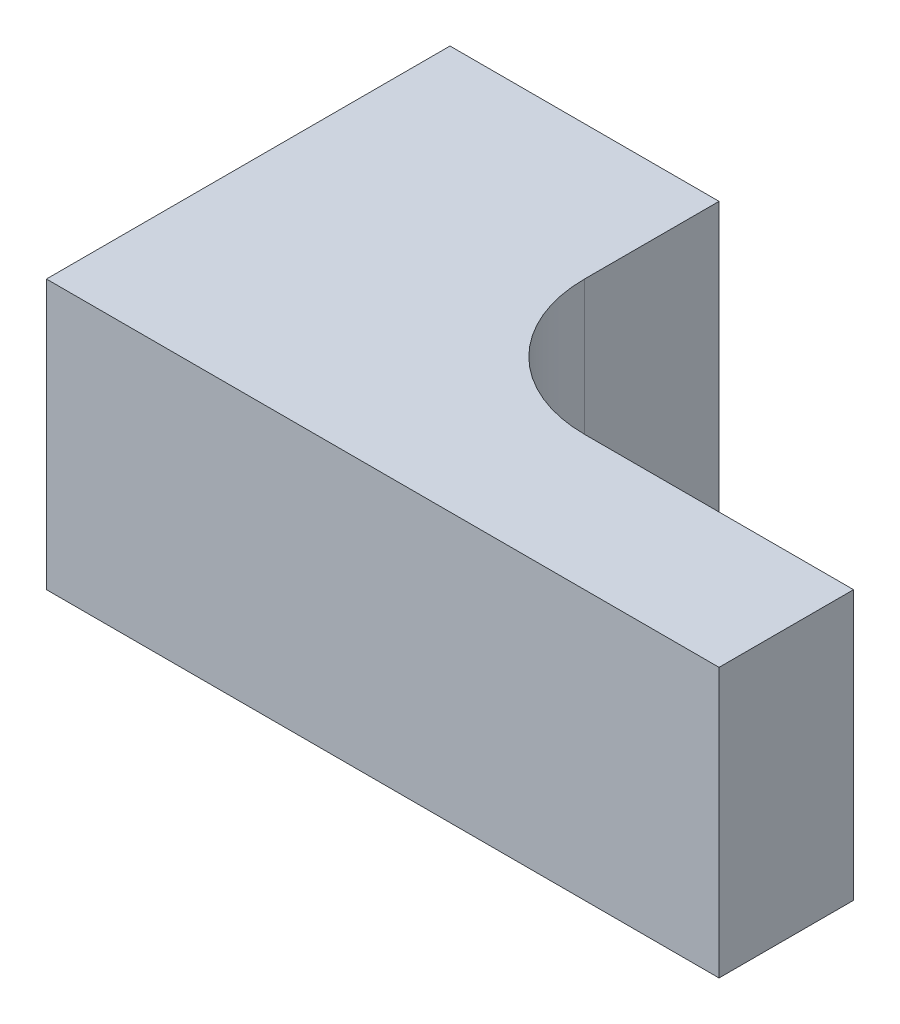
ISO-10303-21;
HEADER;
FILE_DESCRIPTION(('STEP AP214'),'2;1');
FILE_NAME('part.step','',(''),(''),'','','');
FILE_SCHEMA(('AUTOMOTIVE_DESIGN { 1 0 10303 214 1 1 1 1 }'));
ENDSEC;
DATA;
#1=APPLICATION_CONTEXT('core data for automotive mechanical design processes');
#2=APPLICATION_PROTOCOL_DEFINITION('international standard','automotive_design',2000,#1);
#3=PRODUCT_CONTEXT('',#1,'mechanical');
#4=PRODUCT('Part','Part','',(#3));
#5=PRODUCT_RELATED_PRODUCT_CATEGORY('part','',(#4));
#6=PRODUCT_DEFINITION_FORMATION('','',#4);
#7=PRODUCT_DEFINITION_CONTEXT('part definition',#1,'design');
#8=PRODUCT_DEFINITION('design','',#6,#7);
#9=PRODUCT_DEFINITION_SHAPE('','',#8);
#10=(LENGTH_UNIT() NAMED_UNIT(*) SI_UNIT(.MILLI.,.METRE.));
#11=(NAMED_UNIT(*) PLANE_ANGLE_UNIT() SI_UNIT($,.RADIAN.));
#12=(NAMED_UNIT(*) SI_UNIT($,.STERADIAN.) SOLID_ANGLE_UNIT());
#13=UNCERTAINTY_MEASURE_WITH_UNIT(LENGTH_MEASURE(1.E-05),#10,'distance_accuracy_value','');
#14=(GEOMETRIC_REPRESENTATION_CONTEXT(3) GLOBAL_UNCERTAINTY_ASSIGNED_CONTEXT((#13)) GLOBAL_UNIT_ASSIGNED_CONTEXT((#10,
#11,#12)) REPRESENTATION_CONTEXT('',''));
#15=CARTESIAN_POINT('',(0.,0.,0.));
#16=DIRECTION('',(0.,0.,1.));
#17=DIRECTION('',(1.,0.,0.));
#18=AXIS2_PLACEMENT_3D('',#15,#16,#17);
#19=CARTESIAN_POINT('',(-20.,20.,0.));
#20=DIRECTION('',(0.,0.,1.));
#21=DIRECTION('',(1.,0.,0.));
#22=AXIS2_PLACEMENT_3D('',#19,#20,#21);
#23=PLANE('',#22);
#24=DIRECTION('',(-1.,0.,0.));
#25=VECTOR('',#24,1.);
#26=CARTESIAN_POINT('',(-20.,0.,0.));
#27=LINE('',#26,#25);
#28=CARTESIAN_POINT('',(0.,0.,0.));
#29=VERTEX_POINT('',#28);
#30=CARTESIAN_POINT('',(-20.,0.,0.));
#31=VERTEX_POINT('',#30);
#32=EDGE_CURVE('E134',#29,#31,#27,.T.);
#33=ORIENTED_EDGE('',*,*,#32,.T.);
#34=DIRECTION('',(0.,-1.,0.));
#35=VECTOR('',#34,1.);
#36=CARTESIAN_POINT('',(-20.,20.,0.));
#37=LINE('',#36,#35);
#38=CARTESIAN_POINT('',(-20.,20.,0.));
#39=VERTEX_POINT('',#38);
#40=EDGE_CURVE('E11',#39,#31,#37,.T.);
#41=ORIENTED_EDGE('',*,*,#40,.F.);
#42=DIRECTION('',(-1.,0.,0.));
#43=VECTOR('',#42,1.);
#44=CARTESIAN_POINT('',(-20.,20.,0.));
#45=LINE('',#44,#43);
#46=CARTESIAN_POINT('',(0.,20.,0.));
#47=VERTEX_POINT('',#46);
#48=EDGE_CURVE('E153',#47,#39,#45,.T.);
#49=ORIENTED_EDGE('',*,*,#48,.F.);
#50=DIRECTION('',(0.,-1.,0.));
#51=VECTOR('',#50,1.);
#52=CARTESIAN_POINT('',(0.,20.,0.));
#53=LINE('',#52,#51);
#54=EDGE_CURVE('E130',#47,#29,#53,.T.);
#55=ORIENTED_EDGE('',*,*,#54,.T.);
#56=EDGE_LOOP('',(#33,#41,#49,#55));
#57=FACE_BOUND('',#56,.T.);
#58=ADVANCED_FACE('F39',(#57),#23,.F.);
#59=CARTESIAN_POINT('',(-20.,20.,30.));
#60=DIRECTION('',(1.,0.,0.));
#61=DIRECTION('',(0.,0.,-1.));
#62=AXIS2_PLACEMENT_3D('',#59,#60,#61);
#63=PLANE('',#62);
#64=DIRECTION('',(0.,0.,1.));
#65=VECTOR('',#64,1.);
#66=CARTESIAN_POINT('',(-20.,0.,30.));
#67=LINE('',#66,#65);
#68=CARTESIAN_POINT('',(-20.,0.,30.));
#69=VERTEX_POINT('',#68);
#70=EDGE_CURVE('E138',#31,#69,#67,.T.);
#71=ORIENTED_EDGE('',*,*,#70,.T.);
#72=DIRECTION('',(0.,-1.,0.));
#73=VECTOR('',#72,1.);
#74=CARTESIAN_POINT('',(-20.,20.,30.));
#75=LINE('',#74,#73);
#76=CARTESIAN_POINT('',(-20.,20.,30.));
#77=VERTEX_POINT('',#76);
#78=EDGE_CURVE('E48',#77,#69,#75,.T.);
#79=ORIENTED_EDGE('',*,*,#78,.F.);
#80=DIRECTION('',(0.,0.,1.));
#81=VECTOR('',#80,1.);
#82=CARTESIAN_POINT('',(-20.,20.,30.));
#83=LINE('',#82,#81);
#84=EDGE_CURVE('E96',#39,#77,#83,.T.);
#85=ORIENTED_EDGE('',*,*,#84,.F.);
#86=ORIENTED_EDGE('',*,*,#40,.T.);
#87=EDGE_LOOP('',(#71,#79,#85,#86));
#88=FACE_BOUND('',#87,.T.);
#89=ADVANCED_FACE('F187',(#88),#63,.F.);
#90=CARTESIAN_POINT('',(30.,20.,30.));
#91=DIRECTION('',(0.,0.,-1.));
#92=DIRECTION('',(-1.,0.,0.));
#93=AXIS2_PLACEMENT_3D('',#90,#91,#92);
#94=PLANE('',#93);
#95=DIRECTION('',(1.,0.,0.));
#96=VECTOR('',#95,1.);
#97=CARTESIAN_POINT('',(30.,0.,30.));
#98=LINE('',#97,#96);
#99=CARTESIAN_POINT('',(30.,0.,30.));
#100=VERTEX_POINT('',#99);
#101=EDGE_CURVE('E141',#69,#100,#98,.T.);
#102=ORIENTED_EDGE('',*,*,#101,.T.);
#103=DIRECTION('',(0.,-1.,0.));
#104=VECTOR('',#103,1.);
#105=CARTESIAN_POINT('',(30.,20.,30.));
#106=LINE('',#105,#104);
#107=CARTESIAN_POINT('',(30.,20.,30.));
#108=VERTEX_POINT('',#107);
#109=EDGE_CURVE('E160',#108,#100,#106,.T.);
#110=ORIENTED_EDGE('',*,*,#109,.F.);
#111=DIRECTION('',(1.,0.,0.));
#112=VECTOR('',#111,1.);
#113=CARTESIAN_POINT('',(30.,20.,30.));
#114=LINE('',#113,#112);
#115=EDGE_CURVE('E170',#77,#108,#114,.T.);
#116=ORIENTED_EDGE('',*,*,#115,.F.);
#117=ORIENTED_EDGE('',*,*,#78,.T.);
#118=EDGE_LOOP('',(#102,#110,#116,#117));
#119=FACE_BOUND('',#118,.T.);
#120=ADVANCED_FACE('F168',(#119),#94,.F.);
#121=CARTESIAN_POINT('',(30.,20.,20.));
#122=DIRECTION('',(-1.,0.,0.));
#123=DIRECTION('',(0.,0.,1.));
#124=AXIS2_PLACEMENT_3D('',#121,#122,#123);
#125=PLANE('',#124);
#126=DIRECTION('',(0.,0.,-1.));
#127=VECTOR('',#126,1.);
#128=CARTESIAN_POINT('',(30.,0.,20.));
#129=LINE('',#128,#127);
#130=CARTESIAN_POINT('',(30.,0.,20.));
#131=VERTEX_POINT('',#130);
#132=EDGE_CURVE('E144',#100,#131,#129,.T.);
#133=ORIENTED_EDGE('',*,*,#132,.T.);
#134=DIRECTION('',(0.,-1.,0.));
#135=VECTOR('',#134,1.);
#136=CARTESIAN_POINT('',(30.,20.,20.));
#137=LINE('',#136,#135);
#138=CARTESIAN_POINT('',(30.,20.,20.));
#139=VERTEX_POINT('',#138);
#140=EDGE_CURVE('E123',#139,#131,#137,.T.);
#141=ORIENTED_EDGE('',*,*,#140,.F.);
#142=DIRECTION('',(0.,0.,-1.));
#143=VECTOR('',#142,1.);
#144=CARTESIAN_POINT('',(30.,20.,20.));
#145=LINE('',#144,#143);
#146=EDGE_CURVE('E112',#108,#139,#145,.T.);
#147=ORIENTED_EDGE('',*,*,#146,.F.);
#148=ORIENTED_EDGE('',*,*,#109,.T.);
#149=EDGE_LOOP('',(#133,#141,#147,#148));
#150=FACE_BOUND('',#149,.T.);
#151=ADVANCED_FACE('F176',(#150),#125,.F.);
#152=CARTESIAN_POINT('',(10.,20.,20.));
#153=DIRECTION('',(0.,0.,1.));
#154=DIRECTION('',(1.,0.,0.));
#155=AXIS2_PLACEMENT_3D('',#152,#153,#154);
#156=PLANE('',#155);
#157=DIRECTION('',(-1.,0.,0.));
#158=VECTOR('',#157,1.);
#159=CARTESIAN_POINT('',(10.,0.,20.));
#160=LINE('',#159,#158);
#161=CARTESIAN_POINT('',(10.,0.,20.));
#162=VERTEX_POINT('',#161);
#163=EDGE_CURVE('E121',#131,#162,#160,.T.);
#164=ORIENTED_EDGE('',*,*,#163,.T.);
#165=DIRECTION('',(0.,-1.,0.));
#166=VECTOR('',#165,1.);
#167=CARTESIAN_POINT('',(10.,20.,20.));
#168=LINE('',#167,#166);
#169=CARTESIAN_POINT('',(10.,20.,20.));
#170=VERTEX_POINT('',#169);
#171=EDGE_CURVE('E118',#170,#162,#168,.T.);
#172=ORIENTED_EDGE('',*,*,#171,.F.);
#173=DIRECTION('',(-1.,0.,0.));
#174=VECTOR('',#173,1.);
#175=CARTESIAN_POINT('',(10.,20.,20.));
#176=LINE('',#175,#174);
#177=EDGE_CURVE('E106',#139,#170,#176,.T.);
#178=ORIENTED_EDGE('',*,*,#177,.F.);
#179=ORIENTED_EDGE('',*,*,#140,.T.);
#180=EDGE_LOOP('',(#164,#172,#178,#179));
#181=FACE_BOUND('',#180,.T.);
#182=ADVANCED_FACE('F119',(#181),#156,.F.);
#183=CARTESIAN_POINT('',(10.,20.,10.));
#184=DIRECTION('',(0.,-1.,0.));
#185=DIRECTION('',(0.,0.,-1.));
#186=AXIS2_PLACEMENT_3D('',#183,#184,#185);
#187=CYLINDRICAL_SURFACE('',#186,10.);
#188=CARTESIAN_POINT('',(10.,0.,10.));
#189=DIRECTION('',(0.,-1.,0.));
#190=DIRECTION('',(0.,0.,1.));
#191=AXIS2_PLACEMENT_3D('',#188,#189,#190);
#192=CIRCLE('',#191,10.);
#193=CARTESIAN_POINT('',(0.,0.,10.));
#194=VERTEX_POINT('',#193);
#195=EDGE_CURVE('E82',#162,#194,#192,.T.);
#196=ORIENTED_EDGE('',*,*,#195,.T.);
#197=DIRECTION('',(0.,-1.,0.));
#198=VECTOR('',#197,1.);
#199=CARTESIAN_POINT('',(0.,20.,10.));
#200=LINE('',#199,#198);
#201=CARTESIAN_POINT('',(0.,20.,10.));
#202=VERTEX_POINT('',#201);
#203=EDGE_CURVE('E124',#202,#194,#200,.T.);
#204=ORIENTED_EDGE('',*,*,#203,.F.);
#205=CARTESIAN_POINT('',(10.,20.,10.));
#206=DIRECTION('',(0.,-1.,0.));
#207=DIRECTION('',(0.,0.,1.));
#208=AXIS2_PLACEMENT_3D('',#205,#206,#207);
#209=CIRCLE('',#208,10.);
#210=EDGE_CURVE('E110',#170,#202,#209,.T.);
#211=ORIENTED_EDGE('',*,*,#210,.F.);
#212=ORIENTED_EDGE('',*,*,#171,.T.);
#213=EDGE_LOOP('',(#196,#204,#211,#212));
#214=FACE_BOUND('',#213,.T.);
#215=ADVANCED_FACE('F126',(#214),#187,.F.);
#216=CARTESIAN_POINT('',(0.,20.,0.));
#217=DIRECTION('',(-1.,0.,0.));
#218=DIRECTION('',(0.,0.,1.));
#219=AXIS2_PLACEMENT_3D('',#216,#217,#218);
#220=PLANE('',#219);
#221=DIRECTION('',(0.,0.,-1.));
#222=VECTOR('',#221,1.);
#223=CARTESIAN_POINT('',(0.,0.,0.));
#224=LINE('',#223,#222);
#225=EDGE_CURVE('E88',#194,#29,#224,.T.);
#226=ORIENTED_EDGE('',*,*,#225,.T.);
#227=ORIENTED_EDGE('',*,*,#54,.F.);
#228=DIRECTION('',(0.,0.,-1.));
#229=VECTOR('',#228,1.);
#230=CARTESIAN_POINT('',(0.,20.,0.));
#231=LINE('',#230,#229);
#232=EDGE_CURVE('E56',#202,#47,#231,.T.);
#233=ORIENTED_EDGE('',*,*,#232,.F.);
#234=ORIENTED_EDGE('',*,*,#203,.T.);
#235=EDGE_LOOP('',(#226,#227,#233,#234));
#236=FACE_BOUND('',#235,.T.);
#237=ADVANCED_FACE('F201',(#236),#220,.F.);
#238=CARTESIAN_POINT('',(10.,20.,10.));
#239=DIRECTION('',(0.,1.,0.));
#240=DIRECTION('',(0.,0.,1.));
#241=AXIS2_PLACEMENT_3D('',#238,#239,#240);
#242=PLANE('',#241);
#243=ORIENTED_EDGE('',*,*,#48,.T.);
#244=ORIENTED_EDGE('',*,*,#84,.T.);
#245=ORIENTED_EDGE('',*,*,#115,.T.);
#246=ORIENTED_EDGE('',*,*,#146,.T.);
#247=ORIENTED_EDGE('',*,*,#177,.T.);
#248=ORIENTED_EDGE('',*,*,#210,.T.);
#249=ORIENTED_EDGE('',*,*,#232,.T.);
#250=EDGE_LOOP('',(#243,#244,#245,#246,#247,#248,#249));
#251=FACE_BOUND('',#250,.T.);
#252=ADVANCED_FACE('F108',(#251),#242,.T.);
#253=CARTESIAN_POINT('',(10.,0.,10.));
#254=DIRECTION('',(0.,1.,0.));
#255=DIRECTION('',(0.,0.,1.));
#256=AXIS2_PLACEMENT_3D('',#253,#254,#255);
#257=PLANE('',#256);
#258=ORIENTED_EDGE('',*,*,#32,.F.);
#259=ORIENTED_EDGE('',*,*,#225,.F.);
#260=ORIENTED_EDGE('',*,*,#195,.F.);
#261=ORIENTED_EDGE('',*,*,#163,.F.);
#262=ORIENTED_EDGE('',*,*,#132,.F.);
#263=ORIENTED_EDGE('',*,*,#101,.F.);
#264=ORIENTED_EDGE('',*,*,#70,.F.);
#265=EDGE_LOOP('',(#258,#259,#260,#261,#262,#263,#264));
#266=FACE_BOUND('',#265,.T.);
#267=ADVANCED_FACE('F174',(#266),#257,.F.);
#268=CLOSED_SHELL('',(#58,#89,#120,#151,#182,#215,#237,#252,#267));
#269=MANIFOLD_SOLID_BREP('B2',#268);
#270=ADVANCED_BREP_SHAPE_REPRESENTATION('',(#18,#269),#14);
#271=SHAPE_DEFINITION_REPRESENTATION(#9,#270);
ENDSEC;
END-ISO-10303-21;
